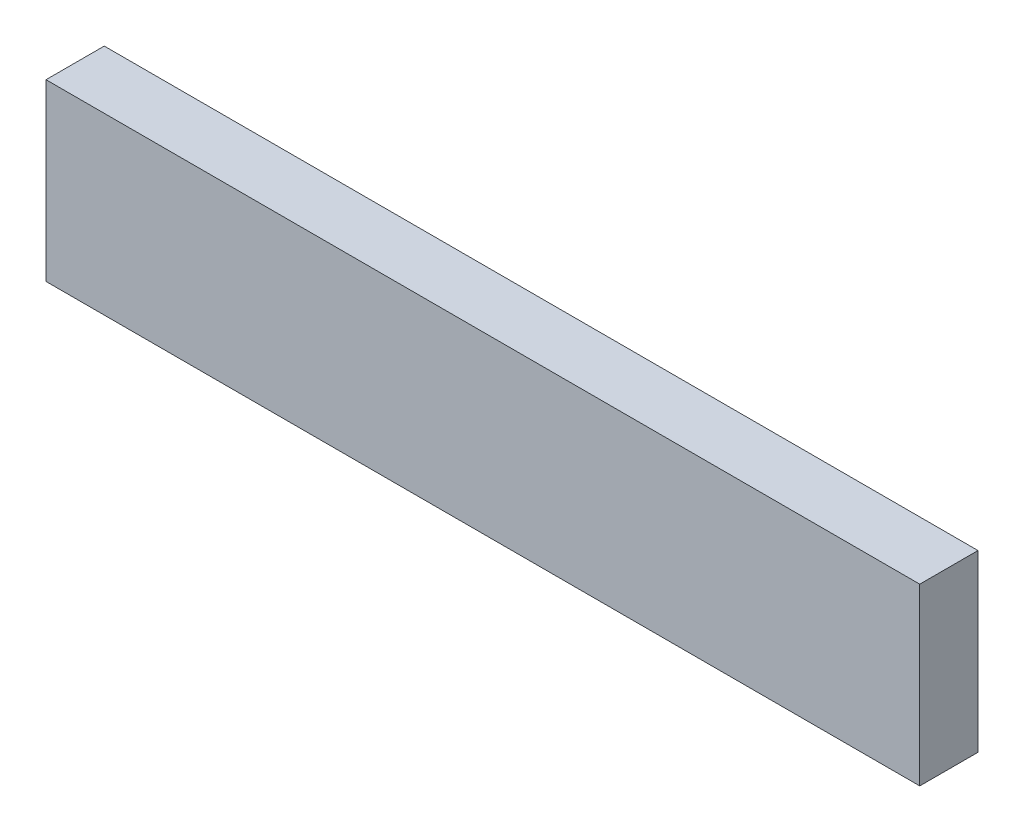
ISO-10303-21;
HEADER;
FILE_DESCRIPTION(('STEP AP214'),'2;1');
FILE_NAME('part.step','',(''),(''),'','','');
FILE_SCHEMA(('AUTOMOTIVE_DESIGN { 1 0 10303 214 1 1 1 1 }'));
ENDSEC;
DATA;
#1=APPLICATION_CONTEXT('core data for automotive mechanical design processes');
#2=APPLICATION_PROTOCOL_DEFINITION('international standard','automotive_design',2000,#1);
#3=PRODUCT_CONTEXT('',#1,'mechanical');
#4=PRODUCT('Part','Part','',(#3));
#5=PRODUCT_RELATED_PRODUCT_CATEGORY('part','',(#4));
#6=PRODUCT_DEFINITION_FORMATION('','',#4);
#7=PRODUCT_DEFINITION_CONTEXT('part definition',#1,'design');
#8=PRODUCT_DEFINITION('design','',#6,#7);
#9=PRODUCT_DEFINITION_SHAPE('','',#8);
#10=(LENGTH_UNIT() NAMED_UNIT(*) SI_UNIT(.MILLI.,.METRE.));
#11=(NAMED_UNIT(*) PLANE_ANGLE_UNIT() SI_UNIT($,.RADIAN.));
#12=(NAMED_UNIT(*) SI_UNIT($,.STERADIAN.) SOLID_ANGLE_UNIT());
#13=UNCERTAINTY_MEASURE_WITH_UNIT(LENGTH_MEASURE(1.E-05),#10,'distance_accuracy_value','');
#14=(GEOMETRIC_REPRESENTATION_CONTEXT(3) GLOBAL_UNCERTAINTY_ASSIGNED_CONTEXT((#13)) GLOBAL_UNIT_ASSIGNED_CONTEXT((#10,
#11,#12)) REPRESENTATION_CONTEXT('',''));
#15=CARTESIAN_POINT('',(0.,0.,0.));
#16=DIRECTION('',(0.,0.,1.));
#17=DIRECTION('',(1.,0.,0.));
#18=AXIS2_PLACEMENT_3D('',#15,#16,#17);
#19=CARTESIAN_POINT('',(150.,-30.,20.));
#20=DIRECTION('',(-1.,0.,0.));
#21=DIRECTION('',(0.,0.,1.));
#22=AXIS2_PLACEMENT_3D('',#19,#20,#21);
#23=PLANE('',#22);
#24=DIRECTION('',(0.,1.,0.));
#25=VECTOR('',#24,1.);
#26=CARTESIAN_POINT('',(150.,-30.,0.));
#27=LINE('',#26,#25);
#28=CARTESIAN_POINT('',(150.,-30.,0.));
#29=VERTEX_POINT('',#28);
#30=CARTESIAN_POINT('',(150.,30.,0.));
#31=VERTEX_POINT('',#30);
#32=EDGE_CURVE('E113',#29,#31,#27,.T.);
#33=ORIENTED_EDGE('',*,*,#32,.T.);
#34=DIRECTION('',(0.,0.,-1.));
#35=VECTOR('',#34,1.);
#36=CARTESIAN_POINT('',(150.,30.,20.));
#37=LINE('',#36,#35);
#38=CARTESIAN_POINT('',(150.,30.,20.));
#39=VERTEX_POINT('',#38);
#40=EDGE_CURVE('E11',#39,#31,#37,.T.);
#41=ORIENTED_EDGE('',*,*,#40,.F.);
#42=DIRECTION('',(0.,1.,0.));
#43=VECTOR('',#42,1.);
#44=CARTESIAN_POINT('',(150.,-30.,20.));
#45=LINE('',#44,#43);
#46=CARTESIAN_POINT('',(150.,-30.,20.));
#47=VERTEX_POINT('',#46);
#48=EDGE_CURVE('E97',#47,#39,#45,.T.);
#49=ORIENTED_EDGE('',*,*,#48,.F.);
#50=DIRECTION('',(0.,0.,-1.));
#51=VECTOR('',#50,1.);
#52=CARTESIAN_POINT('',(150.,-30.,20.));
#53=LINE('',#52,#51);
#54=EDGE_CURVE('E109',#47,#29,#53,.T.);
#55=ORIENTED_EDGE('',*,*,#54,.T.);
#56=EDGE_LOOP('',(#33,#41,#49,#55));
#57=FACE_BOUND('',#56,.T.);
#58=ADVANCED_FACE('F45',(#57),#23,.F.);
#59=CARTESIAN_POINT('',(-150.,30.,20.));
#60=DIRECTION('',(0.,-1.,0.));
#61=DIRECTION('',(0.,0.,-1.));
#62=AXIS2_PLACEMENT_3D('',#59,#60,#61);
#63=PLANE('',#62);
#64=DIRECTION('',(-1.,0.,0.));
#65=VECTOR('',#64,1.);
#66=CARTESIAN_POINT('',(-150.,30.,0.));
#67=LINE('',#66,#65);
#68=CARTESIAN_POINT('',(-150.,30.,0.));
#69=VERTEX_POINT('',#68);
#70=EDGE_CURVE('E102',#31,#69,#67,.T.);
#71=ORIENTED_EDGE('',*,*,#70,.T.);
#72=DIRECTION('',(0.,0.,-1.));
#73=VECTOR('',#72,1.);
#74=CARTESIAN_POINT('',(-150.,30.,20.));
#75=LINE('',#74,#73);
#76=CARTESIAN_POINT('',(-150.,30.,20.));
#77=VERTEX_POINT('',#76);
#78=EDGE_CURVE('E54',#77,#69,#75,.T.);
#79=ORIENTED_EDGE('',*,*,#78,.F.);
#80=DIRECTION('',(-1.,0.,0.));
#81=VECTOR('',#80,1.);
#82=CARTESIAN_POINT('',(-150.,30.,20.));
#83=LINE('',#82,#81);
#84=EDGE_CURVE('E92',#39,#77,#83,.T.);
#85=ORIENTED_EDGE('',*,*,#84,.F.);
#86=ORIENTED_EDGE('',*,*,#40,.T.);
#87=EDGE_LOOP('',(#71,#79,#85,#86));
#88=FACE_BOUND('',#87,.T.);
#89=ADVANCED_FACE('F101',(#88),#63,.F.);
#90=CARTESIAN_POINT('',(-150.,-30.,20.));
#91=DIRECTION('',(1.,0.,0.));
#92=DIRECTION('',(0.,0.,-1.));
#93=AXIS2_PLACEMENT_3D('',#90,#91,#92);
#94=PLANE('',#93);
#95=DIRECTION('',(0.,-1.,0.));
#96=VECTOR('',#95,1.);
#97=CARTESIAN_POINT('',(-150.,-30.,0.));
#98=LINE('',#97,#96);
#99=CARTESIAN_POINT('',(-150.,-30.,0.));
#100=VERTEX_POINT('',#99);
#101=EDGE_CURVE('E79',#69,#100,#98,.T.);
#102=ORIENTED_EDGE('',*,*,#101,.T.);
#103=DIRECTION('',(0.,0.,-1.));
#104=VECTOR('',#103,1.);
#105=CARTESIAN_POINT('',(-150.,-30.,20.));
#106=LINE('',#105,#104);
#107=CARTESIAN_POINT('',(-150.,-30.,20.));
#108=VERTEX_POINT('',#107);
#109=EDGE_CURVE('E104',#108,#100,#106,.T.);
#110=ORIENTED_EDGE('',*,*,#109,.F.);
#111=DIRECTION('',(0.,-1.,0.));
#112=VECTOR('',#111,1.);
#113=CARTESIAN_POINT('',(-150.,-30.,20.));
#114=LINE('',#113,#112);
#115=EDGE_CURVE('E95',#77,#108,#114,.T.);
#116=ORIENTED_EDGE('',*,*,#115,.F.);
#117=ORIENTED_EDGE('',*,*,#78,.T.);
#118=EDGE_LOOP('',(#102,#110,#116,#117));
#119=FACE_BOUND('',#118,.T.);
#120=ADVANCED_FACE('F105',(#119),#94,.F.);
#121=CARTESIAN_POINT('',(-150.,-30.,20.));
#122=DIRECTION('',(0.,1.,0.));
#123=DIRECTION('',(0.,0.,1.));
#124=AXIS2_PLACEMENT_3D('',#121,#122,#123);
#125=PLANE('',#124);
#126=DIRECTION('',(1.,0.,0.));
#127=VECTOR('',#126,1.);
#128=CARTESIAN_POINT('',(-150.,-30.,0.));
#129=LINE('',#128,#127);
#130=EDGE_CURVE('E85',#100,#29,#129,.T.);
#131=ORIENTED_EDGE('',*,*,#130,.T.);
#132=ORIENTED_EDGE('',*,*,#54,.F.);
#133=DIRECTION('',(1.,0.,0.));
#134=VECTOR('',#133,1.);
#135=CARTESIAN_POINT('',(-150.,-30.,20.));
#136=LINE('',#135,#134);
#137=EDGE_CURVE('E62',#108,#47,#136,.T.);
#138=ORIENTED_EDGE('',*,*,#137,.F.);
#139=ORIENTED_EDGE('',*,*,#109,.T.);
#140=EDGE_LOOP('',(#131,#132,#138,#139));
#141=FACE_BOUND('',#140,.T.);
#142=ADVANCED_FACE('F126',(#141),#125,.F.);
#143=CARTESIAN_POINT('',(0.,0.,20.));
#144=DIRECTION('',(0.,0.,-1.));
#145=DIRECTION('',(-1.,0.,0.));
#146=AXIS2_PLACEMENT_3D('',#143,#144,#145);
#147=PLANE('',#146);
#148=ORIENTED_EDGE('',*,*,#48,.T.);
#149=ORIENTED_EDGE('',*,*,#84,.T.);
#150=ORIENTED_EDGE('',*,*,#115,.T.);
#151=ORIENTED_EDGE('',*,*,#137,.T.);
#152=EDGE_LOOP('',(#148,#149,#150,#151));
#153=FACE_BOUND('',#152,.T.);
#154=ADVANCED_FACE('F93',(#153),#147,.F.);
#155=CARTESIAN_POINT('',(0.,0.,0.));
#156=DIRECTION('',(0.,0.,-1.));
#157=DIRECTION('',(-1.,0.,0.));
#158=AXIS2_PLACEMENT_3D('',#155,#156,#157);
#159=PLANE('',#158);
#160=ORIENTED_EDGE('',*,*,#32,.F.);
#161=ORIENTED_EDGE('',*,*,#130,.F.);
#162=ORIENTED_EDGE('',*,*,#101,.F.);
#163=ORIENTED_EDGE('',*,*,#70,.F.);
#164=EDGE_LOOP('',(#160,#161,#162,#163));
#165=FACE_BOUND('',#164,.T.);
#166=ADVANCED_FACE('F129',(#165),#159,.T.);
#167=CLOSED_SHELL('',(#58,#89,#120,#142,#154,#166));
#168=MANIFOLD_SOLID_BREP('B2',#167);
#169=ADVANCED_BREP_SHAPE_REPRESENTATION('',(#18,#168),#14);
#170=SHAPE_DEFINITION_REPRESENTATION(#9,#169);
ENDSEC;
END-ISO-10303-21;
